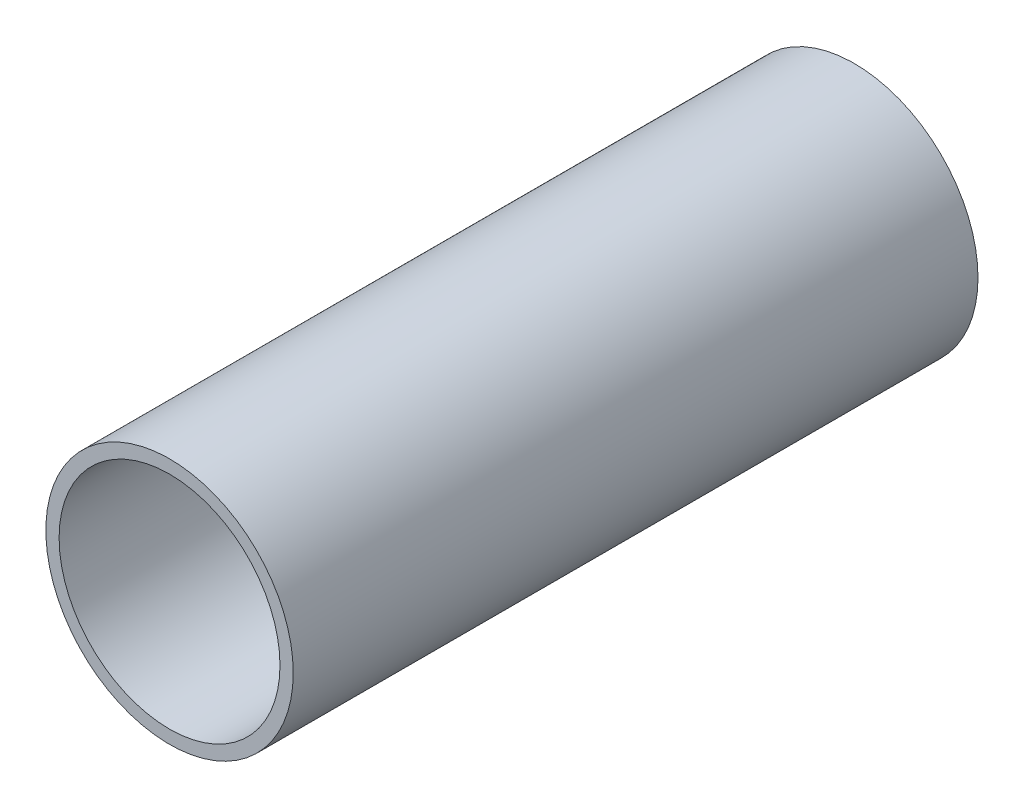
ISO-10303-21;
HEADER;
FILE_DESCRIPTION(('STEP AP214'),'2;1');
FILE_NAME('part.step','',(''),(''),'','','');
FILE_SCHEMA(('AUTOMOTIVE_DESIGN { 1 0 10303 214 1 1 1 1 }'));
ENDSEC;
DATA;
#1=APPLICATION_CONTEXT('core data for automotive mechanical design processes');
#2=APPLICATION_PROTOCOL_DEFINITION('international standard','automotive_design',2000,#1);
#3=PRODUCT_CONTEXT('',#1,'mechanical');
#4=PRODUCT('Part','Part','',(#3));
#5=PRODUCT_RELATED_PRODUCT_CATEGORY('part','',(#4));
#6=PRODUCT_DEFINITION_FORMATION('','',#4);
#7=PRODUCT_DEFINITION_CONTEXT('part definition',#1,'design');
#8=PRODUCT_DEFINITION('design','',#6,#7);
#9=PRODUCT_DEFINITION_SHAPE('','',#8);
#10=(LENGTH_UNIT() NAMED_UNIT(*) SI_UNIT(.MILLI.,.METRE.));
#11=(NAMED_UNIT(*) PLANE_ANGLE_UNIT() SI_UNIT($,.RADIAN.));
#12=(NAMED_UNIT(*) SI_UNIT($,.STERADIAN.) SOLID_ANGLE_UNIT());
#13=UNCERTAINTY_MEASURE_WITH_UNIT(LENGTH_MEASURE(1.E-05),#10,'distance_accuracy_value','');
#14=(GEOMETRIC_REPRESENTATION_CONTEXT(3) GLOBAL_UNCERTAINTY_ASSIGNED_CONTEXT((#13)) GLOBAL_UNIT_ASSIGNED_CONTEXT((#10,
#11,#12)) REPRESENTATION_CONTEXT('',''));
#15=CARTESIAN_POINT('',(0.,0.,0.));
#16=DIRECTION('',(0.,0.,1.));
#17=DIRECTION('',(1.,0.,0.));
#18=AXIS2_PLACEMENT_3D('',#15,#16,#17);
#19=CARTESIAN_POINT('',(0.,0.,310.));
#20=DIRECTION('',(0.,0.,-1.));
#21=DIRECTION('',(-1.,0.,0.));
#22=AXIS2_PLACEMENT_3D('',#19,#20,#21);
#23=CYLINDRICAL_SURFACE('',#22,56.);
#24=CARTESIAN_POINT('',(0.,0.,310.));
#25=DIRECTION('',(0.,0.,1.));
#26=DIRECTION('',(1.,0.,0.));
#27=AXIS2_PLACEMENT_3D('',#24,#25,#26);
#28=CIRCLE('',#27,56.);
#29=CARTESIAN_POINT('',(56.,0.,310.));
#30=VERTEX_POINT('',#29);
#31=EDGE_CURVE('E10',#30,#30,#28,.T.);
#32=ORIENTED_EDGE('',*,*,#31,.F.);
#33=EDGE_LOOP('',(#32));
#34=FACE_BOUND('',#33,.T.);
#35=CARTESIAN_POINT('',(0.,0.,0.));
#36=DIRECTION('',(0.,0.,1.));
#37=DIRECTION('',(1.,0.,0.));
#38=AXIS2_PLACEMENT_3D('',#35,#36,#37);
#39=CIRCLE('',#38,56.);
#40=CARTESIAN_POINT('',(56.,0.,0.));
#41=VERTEX_POINT('',#40);
#42=EDGE_CURVE('E46',#41,#41,#39,.T.);
#43=ORIENTED_EDGE('',*,*,#42,.T.);
#44=EDGE_LOOP('',(#43));
#45=FACE_BOUND('',#44,.T.);
#46=ADVANCED_FACE('F43',(#34,#45),#23,.T.);
#47=CARTESIAN_POINT('',(0.,0.,310.));
#48=DIRECTION('',(0.,0.,1.));
#49=DIRECTION('',(1.,0.,0.));
#50=AXIS2_PLACEMENT_3D('',#47,#48,#49);
#51=PLANE('',#50);
#52=CARTESIAN_POINT('',(0.,0.,310.));
#53=DIRECTION('',(0.,0.,1.));
#54=DIRECTION('',(1.,0.,0.));
#55=AXIS2_PLACEMENT_3D('',#52,#53,#54);
#56=CIRCLE('',#55,50.);
#57=CARTESIAN_POINT('',(50.,0.,310.));
#58=VERTEX_POINT('',#57);
#59=EDGE_CURVE('E57',#58,#58,#56,.T.);
#60=ORIENTED_EDGE('',*,*,#59,.F.);
#61=EDGE_LOOP('',(#60));
#62=FACE_BOUND('',#61,.T.);
#63=ORIENTED_EDGE('',*,*,#31,.T.);
#64=EDGE_LOOP('',(#63));
#65=FACE_BOUND('',#64,.T.);
#66=ADVANCED_FACE('F74',(#62,#65),#51,.T.);
#67=CARTESIAN_POINT('',(0.,0.,0.));
#68=DIRECTION('',(0.,0.,1.));
#69=DIRECTION('',(1.,0.,0.));
#70=AXIS2_PLACEMENT_3D('',#67,#68,#69);
#71=PLANE('',#70);
#72=CARTESIAN_POINT('',(0.,0.,0.));
#73=DIRECTION('',(0.,0.,1.));
#74=DIRECTION('',(1.,0.,0.));
#75=AXIS2_PLACEMENT_3D('',#72,#73,#74);
#76=CIRCLE('',#75,50.);
#77=CARTESIAN_POINT('',(50.,0.,0.));
#78=VERTEX_POINT('',#77);
#79=EDGE_CURVE('E55',#78,#78,#76,.T.);
#80=ORIENTED_EDGE('',*,*,#79,.T.);
#81=EDGE_LOOP('',(#80));
#82=FACE_BOUND('',#81,.T.);
#83=ORIENTED_EDGE('',*,*,#42,.F.);
#84=EDGE_LOOP('',(#83));
#85=FACE_BOUND('',#84,.T.);
#86=ADVANCED_FACE('F65',(#82,#85),#71,.F.);
#87=CARTESIAN_POINT('',(0.,0.,0.));
#88=DIRECTION('',(0.,0.,1.));
#89=DIRECTION('',(1.,0.,0.));
#90=AXIS2_PLACEMENT_3D('',#87,#88,#89);
#91=CYLINDRICAL_SURFACE('',#90,50.);
#92=ORIENTED_EDGE('',*,*,#79,.F.);
#93=EDGE_LOOP('',(#92));
#94=FACE_BOUND('',#93,.T.);
#95=ORIENTED_EDGE('',*,*,#59,.T.);
#96=EDGE_LOOP('',(#95));
#97=FACE_BOUND('',#96,.T.);
#98=ADVANCED_FACE('F68',(#94,#97),#91,.F.);
#99=CLOSED_SHELL('',(#46,#66,#86,#98));
#100=MANIFOLD_SOLID_BREP('B2',#99);
#101=ADVANCED_BREP_SHAPE_REPRESENTATION('',(#18,#100),#14);
#102=SHAPE_DEFINITION_REPRESENTATION(#9,#101);
ENDSEC;
END-ISO-10303-21;
